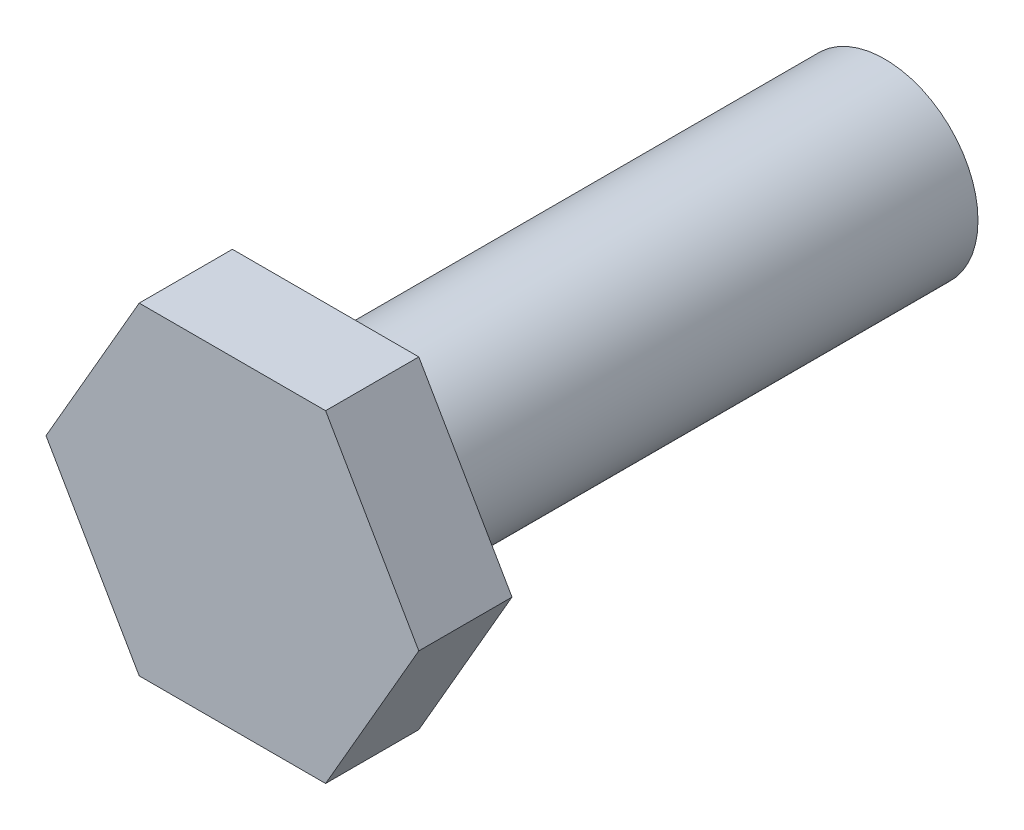
ISO-10303-21;
HEADER;
FILE_DESCRIPTION(('STEP AP214'),'2;1');
FILE_NAME('part.step','',(''),(''),'','','');
FILE_SCHEMA(('AUTOMOTIVE_DESIGN { 1 0 10303 214 1 1 1 1 }'));
ENDSEC;
DATA;
#1=APPLICATION_CONTEXT('core data for automotive mechanical design processes');
#2=APPLICATION_PROTOCOL_DEFINITION('international standard','automotive_design',2000,#1);
#3=PRODUCT_CONTEXT('',#1,'mechanical');
#4=PRODUCT('Part','Part','',(#3));
#5=PRODUCT_RELATED_PRODUCT_CATEGORY('part','',(#4));
#6=PRODUCT_DEFINITION_FORMATION('','',#4);
#7=PRODUCT_DEFINITION_CONTEXT('part definition',#1,'design');
#8=PRODUCT_DEFINITION('design','',#6,#7);
#9=PRODUCT_DEFINITION_SHAPE('','',#8);
#10=(LENGTH_UNIT() NAMED_UNIT(*) SI_UNIT(.MILLI.,.METRE.));
#11=(NAMED_UNIT(*) PLANE_ANGLE_UNIT() SI_UNIT($,.RADIAN.));
#12=(NAMED_UNIT(*) SI_UNIT($,.STERADIAN.) SOLID_ANGLE_UNIT());
#13=UNCERTAINTY_MEASURE_WITH_UNIT(LENGTH_MEASURE(1.E-05),#10,'distance_accuracy_value','');
#14=(GEOMETRIC_REPRESENTATION_CONTEXT(3) GLOBAL_UNCERTAINTY_ASSIGNED_CONTEXT((#13)) GLOBAL_UNIT_ASSIGNED_CONTEXT((#10,
#11,#12)) REPRESENTATION_CONTEXT('',''));
#15=CARTESIAN_POINT('',(0.,0.,0.));
#16=DIRECTION('',(0.,0.,1.));
#17=DIRECTION('',(1.,0.,0.));
#18=AXIS2_PLACEMENT_3D('',#15,#16,#17);
#19=CARTESIAN_POINT('',(0.,0.,30.));
#20=DIRECTION('',(0.,0.,-1.));
#21=DIRECTION('',(-1.,0.,0.));
#22=AXIS2_PLACEMENT_3D('',#19,#20,#21);
#23=CYLINDRICAL_SURFACE('',#22,5.);
#24=CARTESIAN_POINT('',(0.,0.,30.));
#25=DIRECTION('',(0.,0.,1.));
#26=DIRECTION('',(1.,0.,0.));
#27=AXIS2_PLACEMENT_3D('',#24,#25,#26);
#28=CIRCLE('',#27,5.);
#29=CARTESIAN_POINT('',(5.,0.,30.));
#30=VERTEX_POINT('',#29);
#31=EDGE_CURVE('E11',#30,#30,#28,.T.);
#32=ORIENTED_EDGE('',*,*,#31,.F.);
#33=EDGE_LOOP('',(#32));
#34=FACE_BOUND('',#33,.T.);
#35=CARTESIAN_POINT('',(0.,0.,0.));
#36=DIRECTION('',(0.,0.,1.));
#37=DIRECTION('',(1.,0.,0.));
#38=AXIS2_PLACEMENT_3D('',#35,#36,#37);
#39=CIRCLE('',#38,5.);
#40=CARTESIAN_POINT('',(5.,0.,0.));
#41=VERTEX_POINT('',#40);
#42=EDGE_CURVE('E38',#41,#41,#39,.T.);
#43=ORIENTED_EDGE('',*,*,#42,.T.);
#44=EDGE_LOOP('',(#43));
#45=FACE_BOUND('',#44,.T.);
#46=ADVANCED_FACE('F35',(#34,#45),#23,.T.);
#47=CARTESIAN_POINT('',(0.,0.,0.));
#48=DIRECTION('',(0.,0.,1.));
#49=DIRECTION('',(1.,0.,0.));
#50=AXIS2_PLACEMENT_3D('',#47,#48,#49);
#51=PLANE('',#50);
#52=ORIENTED_EDGE('',*,*,#42,.F.);
#53=EDGE_LOOP('',(#52));
#54=FACE_BOUND('',#53,.T.);
#55=ADVANCED_FACE('F143',(#54),#51,.F.);
#56=CARTESIAN_POINT('',(0.,0.,30.));
#57=DIRECTION('',(0.,0.,1.));
#58=DIRECTION('',(1.,0.,0.));
#59=AXIS2_PLACEMENT_3D('',#56,#57,#58);
#60=PLANE('',#59);
#61=DIRECTION('',(-1.,0.,0.));
#62=VECTOR('',#61,1.);
#63=CARTESIAN_POINT('',(0.,8.66025403784438,30.));
#64=LINE('',#63,#62);
#65=CARTESIAN_POINT('',(4.99999999999992,8.66025403784443,30.));
#66=VERTEX_POINT('',#65);
#67=CARTESIAN_POINT('',(-5.0000000000001,8.66025403784433,30.));
#68=VERTEX_POINT('',#67);
#69=EDGE_CURVE('E120',#66,#68,#64,.T.);
#70=ORIENTED_EDGE('',*,*,#69,.F.);
#71=DIRECTION('',(-0.500000000000007,0.866025403784435,0.));
#72=VECTOR('',#71,1.);
#73=CARTESIAN_POINT('',(7.49999999999996,4.33012701892225,30.));
#74=LINE('',#73,#72);
#75=CARTESIAN_POINT('',(10.,0.,30.));
#76=VERTEX_POINT('',#75);
#77=EDGE_CURVE('E80',#76,#66,#74,.T.);
#78=ORIENTED_EDGE('',*,*,#77,.F.);
#79=DIRECTION('',(0.499999999999995,0.866025403784442,0.));
#80=VECTOR('',#79,1.);
#81=CARTESIAN_POINT('',(7.50000000000002,-4.33012701892215,30.));
#82=LINE('',#81,#80);
#83=CARTESIAN_POINT('',(5.00000000000004,-8.66025403784436,30.));
#84=VERTEX_POINT('',#83);
#85=EDGE_CURVE('E74',#84,#76,#82,.T.);
#86=ORIENTED_EDGE('',*,*,#85,.F.);
#87=DIRECTION('',(1.,0.,0.));
#88=VECTOR('',#87,1.);
#89=CARTESIAN_POINT('',(0.,-8.66025403784438,30.));
#90=LINE('',#89,#88);
#91=CARTESIAN_POINT('',(-4.99999999999998,-8.6602540378444,30.));
#92=VERTEX_POINT('',#91);
#93=EDGE_CURVE('E110',#92,#84,#90,.T.);
#94=ORIENTED_EDGE('',*,*,#93,.F.);
#95=DIRECTION('',(0.500000000000001,-0.866025403784438,0.));
#96=VECTOR('',#95,1.);
#97=CARTESIAN_POINT('',(-7.49999999999999,-4.3301270189222,30.));
#98=LINE('',#97,#96);
#99=CARTESIAN_POINT('',(-10.,0.,30.));
#100=VERTEX_POINT('',#99);
#101=EDGE_CURVE('E125',#100,#92,#98,.T.);
#102=ORIENTED_EDGE('',*,*,#101,.F.);
#103=DIRECTION('',(-0.499999999999995,-0.866025403784442,0.));
#104=VECTOR('',#103,1.);
#105=CARTESIAN_POINT('',(-7.50000000000005,4.33012701892216,30.));
#106=LINE('',#105,#104);
#107=EDGE_CURVE('E123',#68,#100,#106,.T.);
#108=ORIENTED_EDGE('',*,*,#107,.F.);
#109=EDGE_LOOP('',(#70,#78,#86,#94,#102,#108));
#110=FACE_BOUND('',#109,.T.);
#111=ORIENTED_EDGE('',*,*,#31,.T.);
#112=EDGE_LOOP('',(#111));
#113=FACE_BOUND('',#112,.T.);
#114=ADVANCED_FACE('F145',(#110,#113),#60,.F.);
#115=CARTESIAN_POINT('',(0.,8.66025403784438,35.));
#116=DIRECTION('',(0.,-1.,0.));
#117=DIRECTION('',(1.,0.,0.));
#118=AXIS2_PLACEMENT_3D('',#115,#116,#117);
#119=PLANE('',#118);
#120=ORIENTED_EDGE('',*,*,#69,.T.);
#121=DIRECTION('',(0.,0.,-1.));
#122=VECTOR('',#121,1.);
#123=CARTESIAN_POINT('',(-5.0000000000001,8.66025403784433,35.));
#124=LINE('',#123,#122);
#125=CARTESIAN_POINT('',(-5.0000000000001,8.66025403784433,35.));
#126=VERTEX_POINT('',#125);
#127=EDGE_CURVE('E137',#126,#68,#124,.T.);
#128=ORIENTED_EDGE('',*,*,#127,.F.);
#129=DIRECTION('',(-1.,0.,0.));
#130=VECTOR('',#129,1.);
#131=CARTESIAN_POINT('',(0.,8.66025403784438,35.));
#132=LINE('',#131,#130);
#133=CARTESIAN_POINT('',(4.99999999999992,8.66025403784443,35.));
#134=VERTEX_POINT('',#133);
#135=EDGE_CURVE('E130',#134,#126,#132,.T.);
#136=ORIENTED_EDGE('',*,*,#135,.F.);
#137=DIRECTION('',(0.,0.,-1.));
#138=VECTOR('',#137,1.);
#139=CARTESIAN_POINT('',(4.99999999999992,8.66025403784443,35.));
#140=LINE('',#139,#138);
#141=EDGE_CURVE('E116',#134,#66,#140,.T.);
#142=ORIENTED_EDGE('',*,*,#141,.T.);
#143=EDGE_LOOP('',(#120,#128,#136,#142));
#144=FACE_BOUND('',#143,.T.);
#145=ADVANCED_FACE('F150',(#144),#119,.F.);
#146=CARTESIAN_POINT('',(-7.50000000000005,4.33012701892216,35.));
#147=DIRECTION('',(0.866025403784442,-0.499999999999995,0.));
#148=DIRECTION('',(0.499999999999995,0.866025403784442,0.));
#149=AXIS2_PLACEMENT_3D('',#146,#147,#148);
#150=PLANE('',#149);
#151=ORIENTED_EDGE('',*,*,#107,.T.);
#152=DIRECTION('',(0.,0.,-1.));
#153=VECTOR('',#152,1.);
#154=CARTESIAN_POINT('',(-10.,0.,35.));
#155=LINE('',#154,#153);
#156=CARTESIAN_POINT('',(-10.,0.,35.));
#157=VERTEX_POINT('',#156);
#158=EDGE_CURVE('E134',#157,#100,#155,.T.);
#159=ORIENTED_EDGE('',*,*,#158,.F.);
#160=DIRECTION('',(-0.499999999999995,-0.866025403784442,0.));
#161=VECTOR('',#160,1.);
#162=CARTESIAN_POINT('',(-7.50000000000005,4.33012701892216,35.));
#163=LINE('',#162,#161);
#164=EDGE_CURVE('E89',#126,#157,#163,.T.);
#165=ORIENTED_EDGE('',*,*,#164,.F.);
#166=ORIENTED_EDGE('',*,*,#127,.T.);
#167=EDGE_LOOP('',(#151,#159,#165,#166));
#168=FACE_BOUND('',#167,.T.);
#169=ADVANCED_FACE('F157',(#168),#150,.F.);
#170=CARTESIAN_POINT('',(-7.49999999999999,-4.3301270189222,35.));
#171=DIRECTION('',(0.866025403784438,0.500000000000001,0.));
#172=DIRECTION('',(-0.500000000000001,0.866025403784438,0.));
#173=AXIS2_PLACEMENT_3D('',#170,#171,#172);
#174=PLANE('',#173);
#175=ORIENTED_EDGE('',*,*,#101,.T.);
#176=DIRECTION('',(0.,0.,-1.));
#177=VECTOR('',#176,1.);
#178=CARTESIAN_POINT('',(-4.99999999999998,-8.6602540378444,35.));
#179=LINE('',#178,#177);
#180=CARTESIAN_POINT('',(-4.99999999999998,-8.6602540378444,35.));
#181=VERTEX_POINT('',#180);
#182=EDGE_CURVE('E111',#181,#92,#179,.T.);
#183=ORIENTED_EDGE('',*,*,#182,.F.);
#184=DIRECTION('',(0.500000000000001,-0.866025403784438,0.));
#185=VECTOR('',#184,1.);
#186=CARTESIAN_POINT('',(-7.49999999999999,-4.3301270189222,35.));
#187=LINE('',#186,#185);
#188=EDGE_CURVE('E102',#157,#181,#187,.T.);
#189=ORIENTED_EDGE('',*,*,#188,.F.);
#190=ORIENTED_EDGE('',*,*,#158,.T.);
#191=EDGE_LOOP('',(#175,#183,#189,#190));
#192=FACE_BOUND('',#191,.T.);
#193=ADVANCED_FACE('F161',(#192),#174,.F.);
#194=CARTESIAN_POINT('',(0.,-8.66025403784438,35.));
#195=DIRECTION('',(0.,1.,0.));
#196=DIRECTION('',(-1.,0.,0.));
#197=AXIS2_PLACEMENT_3D('',#194,#195,#196);
#198=PLANE('',#197);
#199=ORIENTED_EDGE('',*,*,#93,.T.);
#200=DIRECTION('',(0.,0.,-1.));
#201=VECTOR('',#200,1.);
#202=CARTESIAN_POINT('',(5.00000000000004,-8.66025403784436,35.));
#203=LINE('',#202,#201);
#204=CARTESIAN_POINT('',(5.00000000000004,-8.66025403784436,35.));
#205=VERTEX_POINT('',#204);
#206=EDGE_CURVE('E107',#205,#84,#203,.T.);
#207=ORIENTED_EDGE('',*,*,#206,.F.);
#208=DIRECTION('',(1.,0.,0.));
#209=VECTOR('',#208,1.);
#210=CARTESIAN_POINT('',(0.,-8.66025403784438,35.));
#211=LINE('',#210,#209);
#212=EDGE_CURVE('E96',#181,#205,#211,.T.);
#213=ORIENTED_EDGE('',*,*,#212,.F.);
#214=ORIENTED_EDGE('',*,*,#182,.T.);
#215=EDGE_LOOP('',(#199,#207,#213,#214));
#216=FACE_BOUND('',#215,.T.);
#217=ADVANCED_FACE('F108',(#216),#198,.F.);
#218=CARTESIAN_POINT('',(7.50000000000002,-4.33012701892215,35.));
#219=DIRECTION('',(-0.866025403784442,0.499999999999995,0.));
#220=DIRECTION('',(-0.499999999999995,-0.866025403784442,0.));
#221=AXIS2_PLACEMENT_3D('',#218,#219,#220);
#222=PLANE('',#221);
#223=ORIENTED_EDGE('',*,*,#85,.T.);
#224=DIRECTION('',(0.,0.,-1.));
#225=VECTOR('',#224,1.);
#226=CARTESIAN_POINT('',(10.,0.,35.));
#227=LINE('',#226,#225);
#228=CARTESIAN_POINT('',(10.,0.,35.));
#229=VERTEX_POINT('',#228);
#230=EDGE_CURVE('E112',#229,#76,#227,.T.);
#231=ORIENTED_EDGE('',*,*,#230,.F.);
#232=DIRECTION('',(0.499999999999995,0.866025403784442,0.));
#233=VECTOR('',#232,1.);
#234=CARTESIAN_POINT('',(7.50000000000002,-4.33012701892215,35.));
#235=LINE('',#234,#233);
#236=EDGE_CURVE('E100',#205,#229,#235,.T.);
#237=ORIENTED_EDGE('',*,*,#236,.F.);
#238=ORIENTED_EDGE('',*,*,#206,.T.);
#239=EDGE_LOOP('',(#223,#231,#237,#238));
#240=FACE_BOUND('',#239,.T.);
#241=ADVANCED_FACE('F114',(#240),#222,.F.);
#242=CARTESIAN_POINT('',(7.49999999999996,4.33012701892225,35.));
#243=DIRECTION('',(-0.866025403784435,-0.500000000000007,0.));
#244=DIRECTION('',(0.500000000000007,-0.866025403784435,0.));
#245=AXIS2_PLACEMENT_3D('',#242,#243,#244);
#246=PLANE('',#245);
#247=ORIENTED_EDGE('',*,*,#77,.T.);
#248=ORIENTED_EDGE('',*,*,#141,.F.);
#249=DIRECTION('',(-0.500000000000007,0.866025403784435,0.));
#250=VECTOR('',#249,1.);
#251=CARTESIAN_POINT('',(7.49999999999996,4.33012701892225,35.));
#252=LINE('',#251,#250);
#253=EDGE_CURVE('E51',#229,#134,#252,.T.);
#254=ORIENTED_EDGE('',*,*,#253,.F.);
#255=ORIENTED_EDGE('',*,*,#230,.T.);
#256=EDGE_LOOP('',(#247,#248,#254,#255));
#257=FACE_BOUND('',#256,.T.);
#258=ADVANCED_FACE('F169',(#257),#246,.F.);
#259=CARTESIAN_POINT('',(0.,0.,35.));
#260=DIRECTION('',(0.,0.,1.));
#261=DIRECTION('',(1.,0.,0.));
#262=AXIS2_PLACEMENT_3D('',#259,#260,#261);
#263=PLANE('',#262);
#264=ORIENTED_EDGE('',*,*,#135,.T.);
#265=ORIENTED_EDGE('',*,*,#164,.T.);
#266=ORIENTED_EDGE('',*,*,#188,.T.);
#267=ORIENTED_EDGE('',*,*,#212,.T.);
#268=ORIENTED_EDGE('',*,*,#236,.T.);
#269=ORIENTED_EDGE('',*,*,#253,.T.);
#270=EDGE_LOOP('',(#264,#265,#266,#267,#268,#269));
#271=FACE_BOUND('',#270,.T.);
#272=ADVANCED_FACE('F98',(#271),#263,.T.);
#273=CLOSED_SHELL('',(#46,#55,#114,#145,#169,#193,#217,#241,#258,#272));
#274=MANIFOLD_SOLID_BREP('B2',#273);
#275=ADVANCED_BREP_SHAPE_REPRESENTATION('',(#18,#274),#14);
#276=SHAPE_DEFINITION_REPRESENTATION(#9,#275);
ENDSEC;
END-ISO-10303-21;
